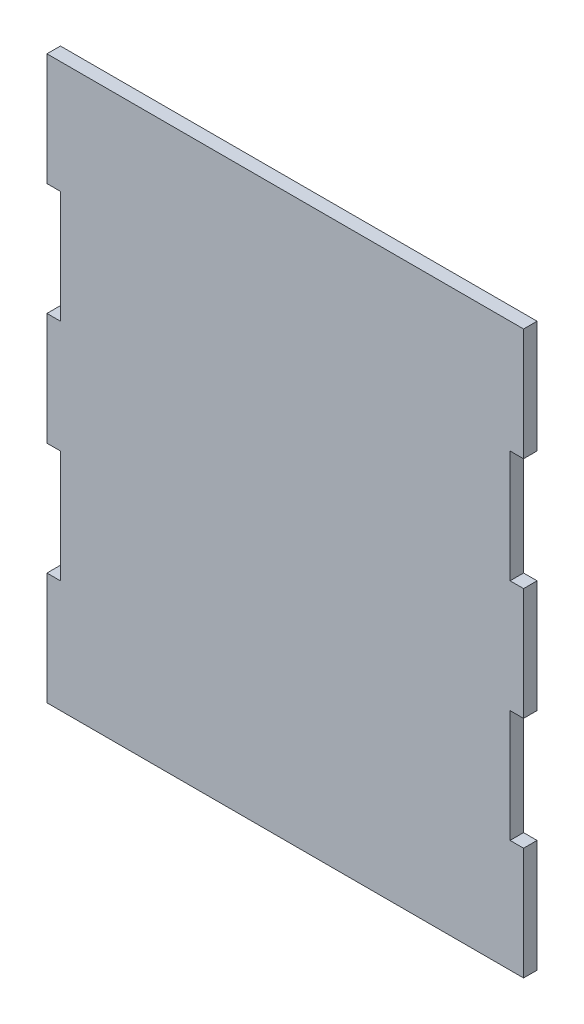
ISO-10303-21;
HEADER;
FILE_DESCRIPTION(('STEP AP214'),'2;1');
FILE_NAME('part.step','',(''),(''),'','','');
FILE_SCHEMA(('AUTOMOTIVE_DESIGN { 1 0 10303 214 1 1 1 1 }'));
ENDSEC;
DATA;
#1=APPLICATION_CONTEXT('core data for automotive mechanical design processes');
#2=APPLICATION_PROTOCOL_DEFINITION('international standard','automotive_design',2000,#1);
#3=PRODUCT_CONTEXT('',#1,'mechanical');
#4=PRODUCT('Part','Part','',(#3));
#5=PRODUCT_RELATED_PRODUCT_CATEGORY('part','',(#4));
#6=PRODUCT_DEFINITION_FORMATION('','',#4);
#7=PRODUCT_DEFINITION_CONTEXT('part definition',#1,'design');
#8=PRODUCT_DEFINITION('design','',#6,#7);
#9=PRODUCT_DEFINITION_SHAPE('','',#8);
#10=(LENGTH_UNIT() NAMED_UNIT(*) SI_UNIT(.MILLI.,.METRE.));
#11=(NAMED_UNIT(*) PLANE_ANGLE_UNIT() SI_UNIT($,.RADIAN.));
#12=(NAMED_UNIT(*) SI_UNIT($,.STERADIAN.) SOLID_ANGLE_UNIT());
#13=UNCERTAINTY_MEASURE_WITH_UNIT(LENGTH_MEASURE(1.E-05),#10,'distance_accuracy_value','');
#14=(GEOMETRIC_REPRESENTATION_CONTEXT(3) GLOBAL_UNCERTAINTY_ASSIGNED_CONTEXT((#13)) GLOBAL_UNIT_ASSIGNED_CONTEXT((#10,
#11,#12)) REPRESENTATION_CONTEXT('',''));
#15=CARTESIAN_POINT('',(0.,0.,0.));
#16=DIRECTION('',(0.,0.,1.));
#17=DIRECTION('',(1.,0.,0.));
#18=AXIS2_PLACEMENT_3D('',#15,#16,#17);
#19=CARTESIAN_POINT('',(53.,0.,3.));
#20=DIRECTION('',(-1.,0.,0.));
#21=DIRECTION('',(0.,0.,1.));
#22=AXIS2_PLACEMENT_3D('',#19,#20,#21);
#23=PLANE('',#22);
#24=DIRECTION('',(0.,1.,0.));
#25=VECTOR('',#24,1.);
#26=CARTESIAN_POINT('',(53.,0.,0.));
#27=LINE('',#26,#25);
#28=CARTESIAN_POINT('',(53.,-25.,0.));
#29=VERTEX_POINT('',#28);
#30=CARTESIAN_POINT('',(53.,0.,0.));
#31=VERTEX_POINT('',#30);
#32=EDGE_CURVE('E201',#29,#31,#27,.T.);
#33=ORIENTED_EDGE('',*,*,#32,.T.);
#34=DIRECTION('',(0.,0.,-1.));
#35=VECTOR('',#34,1.);
#36=CARTESIAN_POINT('',(53.,0.,3.));
#37=LINE('',#36,#35);
#38=CARTESIAN_POINT('',(53.,0.,3.));
#39=VERTEX_POINT('',#38);
#40=EDGE_CURVE('E11',#39,#31,#37,.T.);
#41=ORIENTED_EDGE('',*,*,#40,.F.);
#42=DIRECTION('',(0.,1.,0.));
#43=VECTOR('',#42,1.);
#44=CARTESIAN_POINT('',(53.,0.,3.));
#45=LINE('',#44,#43);
#46=CARTESIAN_POINT('',(53.,-25.,3.));
#47=VERTEX_POINT('',#46);
#48=EDGE_CURVE('E239',#47,#39,#45,.T.);
#49=ORIENTED_EDGE('',*,*,#48,.F.);
#50=DIRECTION('',(0.,0.,-1.));
#51=VECTOR('',#50,1.);
#52=CARTESIAN_POINT('',(53.,-25.,3.));
#53=LINE('',#52,#51);
#54=EDGE_CURVE('E197',#47,#29,#53,.T.);
#55=ORIENTED_EDGE('',*,*,#54,.T.);
#56=EDGE_LOOP('',(#33,#41,#49,#55));
#57=FACE_BOUND('',#56,.T.);
#58=ADVANCED_FACE('F33',(#57),#23,.F.);
#59=CARTESIAN_POINT('',(-53.,8.53206392293518E-13,3.));
#60=DIRECTION('',(0.,-1.,0.));
#61=DIRECTION('',(1.,0.,0.));
#62=AXIS2_PLACEMENT_3D('',#59,#60,#61);
#63=PLANE('',#62);
#64=DIRECTION('',(-1.,0.,0.));
#65=VECTOR('',#64,1.);
#66=CARTESIAN_POINT('',(-53.,8.53206392293518E-13,0.));
#67=LINE('',#66,#65);
#68=CARTESIAN_POINT('',(-53.,8.53206392293518E-13,0.));
#69=VERTEX_POINT('',#68);
#70=EDGE_CURVE('E204',#31,#69,#67,.T.);
#71=ORIENTED_EDGE('',*,*,#70,.T.);
#72=DIRECTION('',(0.,0.,-1.));
#73=VECTOR('',#72,1.);
#74=CARTESIAN_POINT('',(-53.,8.53206392293518E-13,3.));
#75=LINE('',#74,#73);
#76=CARTESIAN_POINT('',(-53.,8.53206392293518E-13,3.));
#77=VERTEX_POINT('',#76);
#78=EDGE_CURVE('E41',#77,#69,#75,.T.);
#79=ORIENTED_EDGE('',*,*,#78,.F.);
#80=DIRECTION('',(-1.,0.,0.));
#81=VECTOR('',#80,1.);
#82=CARTESIAN_POINT('',(-53.,8.53206392293518E-13,3.));
#83=LINE('',#82,#81);
#84=EDGE_CURVE('E128',#39,#77,#83,.T.);
#85=ORIENTED_EDGE('',*,*,#84,.F.);
#86=ORIENTED_EDGE('',*,*,#40,.T.);
#87=EDGE_LOOP('',(#71,#79,#85,#86));
#88=FACE_BOUND('',#87,.T.);
#89=ADVANCED_FACE('F357',(#88),#63,.F.);
#90=CARTESIAN_POINT('',(-53.,8.53206392293518E-13,3.));
#91=DIRECTION('',(1.,0.,0.));
#92=DIRECTION('',(0.,1.,0.));
#93=AXIS2_PLACEMENT_3D('',#90,#91,#92);
#94=PLANE('',#93);
#95=DIRECTION('',(0.,-1.,0.));
#96=VECTOR('',#95,1.);
#97=CARTESIAN_POINT('',(-53.,8.53206392293518E-13,0.));
#98=LINE('',#97,#96);
#99=CARTESIAN_POINT('',(-53.0000000000004,-24.9999999999991,0.));
#100=VERTEX_POINT('',#99);
#101=EDGE_CURVE('E206',#69,#100,#98,.T.);
#102=ORIENTED_EDGE('',*,*,#101,.T.);
#103=DIRECTION('',(0.,0.,-1.));
#104=VECTOR('',#103,1.);
#105=CARTESIAN_POINT('',(-53.0000000000004,-24.9999999999991,3.));
#106=LINE('',#105,#104);
#107=CARTESIAN_POINT('',(-53.0000000000004,-24.9999999999991,3.));
#108=VERTEX_POINT('',#107);
#109=EDGE_CURVE('E282',#108,#100,#106,.T.);
#110=ORIENTED_EDGE('',*,*,#109,.F.);
#111=DIRECTION('',(0.,-1.,0.));
#112=VECTOR('',#111,1.);
#113=CARTESIAN_POINT('',(-53.,8.53206392293518E-13,3.));
#114=LINE('',#113,#112);
#115=EDGE_CURVE('E290',#77,#108,#114,.T.);
#116=ORIENTED_EDGE('',*,*,#115,.F.);
#117=ORIENTED_EDGE('',*,*,#78,.T.);
#118=EDGE_LOOP('',(#102,#110,#116,#117));
#119=FACE_BOUND('',#118,.T.);
#120=ADVANCED_FACE('F288',(#119),#94,.F.);
#121=CARTESIAN_POINT('',(-53.0000000000004,-24.9999999999991,3.));
#122=DIRECTION('',(0.,1.,0.));
#123=DIRECTION('',(-1.,0.,0.));
#124=AXIS2_PLACEMENT_3D('',#121,#122,#123);
#125=PLANE('',#124);
#126=DIRECTION('',(1.,0.,0.));
#127=VECTOR('',#126,1.);
#128=CARTESIAN_POINT('',(-53.0000000000004,-24.9999999999991,0.));
#129=LINE('',#128,#127);
#130=CARTESIAN_POINT('',(-50.0000000000004,-24.9999999999992,0.));
#131=VERTEX_POINT('',#130);
#132=EDGE_CURVE('E208',#100,#131,#129,.T.);
#133=ORIENTED_EDGE('',*,*,#132,.T.);
#134=DIRECTION('',(0.,0.,-1.));
#135=VECTOR('',#134,1.);
#136=CARTESIAN_POINT('',(-50.0000000000004,-24.9999999999992,3.));
#137=LINE('',#136,#135);
#138=CARTESIAN_POINT('',(-50.0000000000004,-24.9999999999992,3.));
#139=VERTEX_POINT('',#138);
#140=EDGE_CURVE('E279',#139,#131,#137,.T.);
#141=ORIENTED_EDGE('',*,*,#140,.F.);
#142=DIRECTION('',(1.,0.,0.));
#143=VECTOR('',#142,1.);
#144=CARTESIAN_POINT('',(-53.0000000000004,-24.9999999999991,3.));
#145=LINE('',#144,#143);
#146=EDGE_CURVE('E308',#108,#139,#145,.T.);
#147=ORIENTED_EDGE('',*,*,#146,.F.);
#148=ORIENTED_EDGE('',*,*,#109,.T.);
#149=EDGE_LOOP('',(#133,#141,#147,#148));
#150=FACE_BOUND('',#149,.T.);
#151=ADVANCED_FACE('F299',(#150),#125,.F.);
#152=CARTESIAN_POINT('',(-50.0000000000004,-24.9999999999992,3.));
#153=DIRECTION('',(1.,0.,0.));
#154=DIRECTION('',(0.,1.,0.));
#155=AXIS2_PLACEMENT_3D('',#152,#153,#154);
#156=PLANE('',#155);
#157=DIRECTION('',(0.,-1.,0.));
#158=VECTOR('',#157,1.);
#159=CARTESIAN_POINT('',(-50.0000000000004,-24.9999999999992,0.));
#160=LINE('',#159,#158);
#161=CARTESIAN_POINT('',(-50.0000000000008,-49.9999999999992,0.));
#162=VERTEX_POINT('',#161);
#163=EDGE_CURVE('E210',#131,#162,#160,.T.);
#164=ORIENTED_EDGE('',*,*,#163,.T.);
#165=DIRECTION('',(0.,0.,-1.));
#166=VECTOR('',#165,1.);
#167=CARTESIAN_POINT('',(-50.0000000000008,-49.9999999999992,3.));
#168=LINE('',#167,#166);
#169=CARTESIAN_POINT('',(-50.0000000000008,-49.9999999999992,3.));
#170=VERTEX_POINT('',#169);
#171=EDGE_CURVE('E276',#170,#162,#168,.T.);
#172=ORIENTED_EDGE('',*,*,#171,.F.);
#173=DIRECTION('',(0.,-1.,0.));
#174=VECTOR('',#173,1.);
#175=CARTESIAN_POINT('',(-50.0000000000004,-24.9999999999992,3.));
#176=LINE('',#175,#174);
#177=EDGE_CURVE('E305',#139,#170,#176,.T.);
#178=ORIENTED_EDGE('',*,*,#177,.F.);
#179=ORIENTED_EDGE('',*,*,#140,.T.);
#180=EDGE_LOOP('',(#164,#172,#178,#179));
#181=FACE_BOUND('',#180,.T.);
#182=ADVANCED_FACE('F303',(#181),#156,.F.);
#183=CARTESIAN_POINT('',(-53.0000000000008,-50.0000001560952,3.));
#184=DIRECTION('',(5.2031994453768E-08,-0.999999999999999,0.));
#185=DIRECTION('',(0.999999999999999,5.2031994453768E-08,0.));
#186=AXIS2_PLACEMENT_3D('',#183,#184,#185);
#187=PLANE('',#186);
#188=DIRECTION('',(-0.999999999999999,-5.2031994453768E-08,0.));
#189=VECTOR('',#188,1.);
#190=CARTESIAN_POINT('',(-53.0000000000008,-50.0000001560952,0.));
#191=LINE('',#190,#189);
#192=CARTESIAN_POINT('',(-53.0000000000008,-50.0000001560952,0.));
#193=VERTEX_POINT('',#192);
#194=EDGE_CURVE('E212',#162,#193,#191,.T.);
#195=ORIENTED_EDGE('',*,*,#194,.T.);
#196=DIRECTION('',(0.,0.,-1.));
#197=VECTOR('',#196,1.);
#198=CARTESIAN_POINT('',(-53.0000000000008,-50.0000001560952,3.));
#199=LINE('',#198,#197);
#200=CARTESIAN_POINT('',(-53.0000000000008,-50.0000001560952,3.));
#201=VERTEX_POINT('',#200);
#202=EDGE_CURVE('E273',#201,#193,#199,.T.);
#203=ORIENTED_EDGE('',*,*,#202,.F.);
#204=DIRECTION('',(-0.999999999999999,-5.2031994453768E-08,0.));
#205=VECTOR('',#204,1.);
#206=CARTESIAN_POINT('',(-53.0000000000008,-50.0000001560952,3.));
#207=LINE('',#206,#205);
#208=EDGE_CURVE('E307',#170,#201,#207,.T.);
#209=ORIENTED_EDGE('',*,*,#208,.F.);
#210=ORIENTED_EDGE('',*,*,#171,.T.);
#211=EDGE_LOOP('',(#195,#203,#209,#210));
#212=FACE_BOUND('',#211,.T.);
#213=ADVANCED_FACE('F370',(#212),#187,.F.);
#214=CARTESIAN_POINT('',(-53.0000000000008,-50.0000001560952,3.));
#215=DIRECTION('',(1.,0.,0.));
#216=DIRECTION('',(0.,1.,0.));
#217=AXIS2_PLACEMENT_3D('',#214,#215,#216);
#218=PLANE('',#217);
#219=DIRECTION('',(0.,-1.,0.));
#220=VECTOR('',#219,1.);
#221=CARTESIAN_POINT('',(-53.0000000000008,-50.0000001560952,0.));
#222=LINE('',#221,#220);
#223=CARTESIAN_POINT('',(-53.,-75.000000156096,0.));
#224=VERTEX_POINT('',#223);
#225=EDGE_CURVE('E214',#193,#224,#222,.T.);
#226=ORIENTED_EDGE('',*,*,#225,.T.);
#227=DIRECTION('',(0.,0.,-1.));
#228=VECTOR('',#227,1.);
#229=CARTESIAN_POINT('',(-53.,-75.000000156096,3.));
#230=LINE('',#229,#228);
#231=CARTESIAN_POINT('',(-53.,-75.000000156096,3.));
#232=VERTEX_POINT('',#231);
#233=EDGE_CURVE('E270',#232,#224,#230,.T.);
#234=ORIENTED_EDGE('',*,*,#233,.F.);
#235=DIRECTION('',(0.,-1.,0.));
#236=VECTOR('',#235,1.);
#237=CARTESIAN_POINT('',(-53.0000000000008,-50.0000001560952,3.));
#238=LINE('',#237,#236);
#239=EDGE_CURVE('E310',#201,#232,#238,.T.);
#240=ORIENTED_EDGE('',*,*,#239,.F.);
#241=ORIENTED_EDGE('',*,*,#202,.T.);
#242=EDGE_LOOP('',(#226,#234,#240,#241));
#243=FACE_BOUND('',#242,.T.);
#244=ADVANCED_FACE('F373',(#243),#218,.F.);
#245=CARTESIAN_POINT('',(-53.,-75.000000156096,3.));
#246=DIRECTION('',(0.,1.,0.));
#247=DIRECTION('',(-1.,0.,0.));
#248=AXIS2_PLACEMENT_3D('',#245,#246,#247);
#249=PLANE('',#248);
#250=DIRECTION('',(1.,0.,0.));
#251=VECTOR('',#250,1.);
#252=CARTESIAN_POINT('',(-53.,-75.000000156096,0.));
#253=LINE('',#252,#251);
#254=CARTESIAN_POINT('',(-50.0000000000005,-75.000000156096,0.));
#255=VERTEX_POINT('',#254);
#256=EDGE_CURVE('E216',#224,#255,#253,.T.);
#257=ORIENTED_EDGE('',*,*,#256,.T.);
#258=DIRECTION('',(0.,0.,-1.));
#259=VECTOR('',#258,1.);
#260=CARTESIAN_POINT('',(-50.0000000000005,-75.000000156096,3.));
#261=LINE('',#260,#259);
#262=CARTESIAN_POINT('',(-50.0000000000005,-75.000000156096,3.));
#263=VERTEX_POINT('',#262);
#264=EDGE_CURVE('E267',#263,#255,#261,.T.);
#265=ORIENTED_EDGE('',*,*,#264,.F.);
#266=DIRECTION('',(1.,0.,0.));
#267=VECTOR('',#266,1.);
#268=CARTESIAN_POINT('',(-53.,-75.000000156096,3.));
#269=LINE('',#268,#267);
#270=EDGE_CURVE('E316',#232,#263,#269,.T.);
#271=ORIENTED_EDGE('',*,*,#270,.F.);
#272=ORIENTED_EDGE('',*,*,#233,.T.);
#273=EDGE_LOOP('',(#257,#265,#271,#272));
#274=FACE_BOUND('',#273,.T.);
#275=ADVANCED_FACE('F377',(#274),#249,.F.);
#276=CARTESIAN_POINT('',(-50.0000000000005,-75.000000156096,3.));
#277=DIRECTION('',(1.,0.,0.));
#278=DIRECTION('',(0.,0.,-1.));
#279=AXIS2_PLACEMENT_3D('',#276,#277,#278);
#280=PLANE('',#279);
#281=DIRECTION('',(0.,-1.,0.));
#282=VECTOR('',#281,1.);
#283=CARTESIAN_POINT('',(-50.0000000000005,-75.000000156096,0.));
#284=LINE('',#283,#282);
#285=CARTESIAN_POINT('',(-50.0000000000005,-100.000000156096,0.));
#286=VERTEX_POINT('',#285);
#287=EDGE_CURVE('E218',#255,#286,#284,.T.);
#288=ORIENTED_EDGE('',*,*,#287,.T.);
#289=DIRECTION('',(0.,0.,-1.));
#290=VECTOR('',#289,1.);
#291=CARTESIAN_POINT('',(-50.0000000000005,-100.000000156096,3.));
#292=LINE('',#291,#290);
#293=CARTESIAN_POINT('',(-50.0000000000005,-100.000000156096,3.));
#294=VERTEX_POINT('',#293);
#295=EDGE_CURVE('E264',#294,#286,#292,.T.);
#296=ORIENTED_EDGE('',*,*,#295,.F.);
#297=DIRECTION('',(0.,-1.,0.));
#298=VECTOR('',#297,1.);
#299=CARTESIAN_POINT('',(-50.0000000000005,-75.000000156096,3.));
#300=LINE('',#299,#298);
#301=EDGE_CURVE('E318',#263,#294,#300,.T.);
#302=ORIENTED_EDGE('',*,*,#301,.F.);
#303=ORIENTED_EDGE('',*,*,#264,.T.);
#304=EDGE_LOOP('',(#288,#296,#302,#303));
#305=FACE_BOUND('',#304,.T.);
#306=ADVANCED_FACE('F381',(#305),#280,.F.);
#307=CARTESIAN_POINT('',(-53.0000000000016,-100.000000312191,3.));
#308=DIRECTION('',(5.20317261498514E-08,-0.999999999999999,0.));
#309=DIRECTION('',(0.999999999999999,5.20317261498514E-08,0.));
#310=AXIS2_PLACEMENT_3D('',#307,#308,#309);
#311=PLANE('',#310);
#312=DIRECTION('',(-0.999999999999999,-5.20317261498514E-08,0.));
#313=VECTOR('',#312,1.);
#314=CARTESIAN_POINT('',(-53.0000000000016,-100.000000312191,0.));
#315=LINE('',#314,#313);
#316=CARTESIAN_POINT('',(-53.0000000000016,-100.000000312191,0.));
#317=VERTEX_POINT('',#316);
#318=EDGE_CURVE('E220',#286,#317,#315,.T.);
#319=ORIENTED_EDGE('',*,*,#318,.T.);
#320=DIRECTION('',(0.,0.,-1.));
#321=VECTOR('',#320,1.);
#322=CARTESIAN_POINT('',(-53.0000000000016,-100.000000312191,3.));
#323=LINE('',#322,#321);
#324=CARTESIAN_POINT('',(-53.0000000000016,-100.000000312191,3.));
#325=VERTEX_POINT('',#324);
#326=EDGE_CURVE('E261',#325,#317,#323,.T.);
#327=ORIENTED_EDGE('',*,*,#326,.F.);
#328=DIRECTION('',(-0.999999999999999,-5.20317261498514E-08,0.));
#329=VECTOR('',#328,1.);
#330=CARTESIAN_POINT('',(-53.0000000000016,-100.000000312191,3.));
#331=LINE('',#330,#329);
#332=EDGE_CURVE('E320',#294,#325,#331,.T.);
#333=ORIENTED_EDGE('',*,*,#332,.F.);
#334=ORIENTED_EDGE('',*,*,#295,.T.);
#335=EDGE_LOOP('',(#319,#327,#333,#334));
#336=FACE_BOUND('',#335,.T.);
#337=ADVANCED_FACE('F385',(#336),#311,.F.);
#338=CARTESIAN_POINT('',(-53.0000000000016,-100.000000312191,3.));
#339=DIRECTION('',(1.,0.,0.));
#340=DIRECTION('',(0.,1.,0.));
#341=AXIS2_PLACEMENT_3D('',#338,#339,#340);
#342=PLANE('',#341);
#343=DIRECTION('',(0.,-1.,0.));
#344=VECTOR('',#343,1.);
#345=CARTESIAN_POINT('',(-53.0000000000016,-100.000000312191,0.));
#346=LINE('',#345,#344);
#347=CARTESIAN_POINT('',(-53.,-125.000000312192,0.));
#348=VERTEX_POINT('',#347);
#349=EDGE_CURVE('E222',#317,#348,#346,.T.);
#350=ORIENTED_EDGE('',*,*,#349,.T.);
#351=DIRECTION('',(0.,0.,-1.));
#352=VECTOR('',#351,1.);
#353=CARTESIAN_POINT('',(-53.,-125.000000312192,3.));
#354=LINE('',#353,#352);
#355=CARTESIAN_POINT('',(-53.,-125.000000312192,3.));
#356=VERTEX_POINT('',#355);
#357=EDGE_CURVE('E258',#356,#348,#354,.T.);
#358=ORIENTED_EDGE('',*,*,#357,.F.);
#359=DIRECTION('',(0.,-1.,0.));
#360=VECTOR('',#359,1.);
#361=CARTESIAN_POINT('',(-53.0000000000016,-100.000000312191,3.));
#362=LINE('',#361,#360);
#363=EDGE_CURVE('E322',#325,#356,#362,.T.);
#364=ORIENTED_EDGE('',*,*,#363,.F.);
#365=ORIENTED_EDGE('',*,*,#326,.T.);
#366=EDGE_LOOP('',(#350,#358,#364,#365));
#367=FACE_BOUND('',#366,.T.);
#368=ADVANCED_FACE('F389',(#367),#342,.F.);
#369=CARTESIAN_POINT('',(53.,-125.000000312192,3.));
#370=DIRECTION('',(0.,1.,0.));
#371=DIRECTION('',(0.,0.,1.));
#372=AXIS2_PLACEMENT_3D('',#369,#370,#371);
#373=PLANE('',#372);
#374=DIRECTION('',(1.,0.,0.));
#375=VECTOR('',#374,1.);
#376=CARTESIAN_POINT('',(53.,-125.000000312192,0.));
#377=LINE('',#376,#375);
#378=CARTESIAN_POINT('',(53.,-125.000000312192,0.));
#379=VERTEX_POINT('',#378);
#380=EDGE_CURVE('E224',#348,#379,#377,.T.);
#381=ORIENTED_EDGE('',*,*,#380,.T.);
#382=DIRECTION('',(0.,0.,-1.));
#383=VECTOR('',#382,1.);
#384=CARTESIAN_POINT('',(53.,-125.000000312192,3.));
#385=LINE('',#384,#383);
#386=CARTESIAN_POINT('',(53.,-125.000000312192,3.));
#387=VERTEX_POINT('',#386);
#388=EDGE_CURVE('E255',#387,#379,#385,.T.);
#389=ORIENTED_EDGE('',*,*,#388,.F.);
#390=DIRECTION('',(1.,0.,0.));
#391=VECTOR('',#390,1.);
#392=CARTESIAN_POINT('',(53.,-125.000000312192,3.));
#393=LINE('',#392,#391);
#394=EDGE_CURVE('E324',#356,#387,#393,.T.);
#395=ORIENTED_EDGE('',*,*,#394,.F.);
#396=ORIENTED_EDGE('',*,*,#357,.T.);
#397=EDGE_LOOP('',(#381,#389,#395,#396));
#398=FACE_BOUND('',#397,.T.);
#399=ADVANCED_FACE('F393',(#398),#373,.F.);
#400=CARTESIAN_POINT('',(53.,-100.000000312192,3.));
#401=DIRECTION('',(-1.,0.,0.));
#402=DIRECTION('',(0.,0.,1.));
#403=AXIS2_PLACEMENT_3D('',#400,#401,#402);
#404=PLANE('',#403);
#405=DIRECTION('',(0.,1.,0.));
#406=VECTOR('',#405,1.);
#407=CARTESIAN_POINT('',(53.,-100.000000312192,0.));
#408=LINE('',#407,#406);
#409=CARTESIAN_POINT('',(53.,-100.000000312192,0.));
#410=VERTEX_POINT('',#409);
#411=EDGE_CURVE('E226',#379,#410,#408,.T.);
#412=ORIENTED_EDGE('',*,*,#411,.T.);
#413=DIRECTION('',(0.,0.,-1.));
#414=VECTOR('',#413,1.);
#415=CARTESIAN_POINT('',(53.,-100.000000312192,3.));
#416=LINE('',#415,#414);
#417=CARTESIAN_POINT('',(53.,-100.000000312192,3.));
#418=VERTEX_POINT('',#417);
#419=EDGE_CURVE('E252',#418,#410,#416,.T.);
#420=ORIENTED_EDGE('',*,*,#419,.F.);
#421=DIRECTION('',(0.,1.,0.));
#422=VECTOR('',#421,1.);
#423=CARTESIAN_POINT('',(53.,-100.000000312192,3.));
#424=LINE('',#423,#422);
#425=EDGE_CURVE('E326',#387,#418,#424,.T.);
#426=ORIENTED_EDGE('',*,*,#425,.F.);
#427=ORIENTED_EDGE('',*,*,#388,.T.);
#428=EDGE_LOOP('',(#412,#420,#426,#427));
#429=FACE_BOUND('',#428,.T.);
#430=ADVANCED_FACE('F397',(#429),#404,.F.);
#431=CARTESIAN_POINT('',(53.,-100.000000312192,3.));
#432=DIRECTION('',(-5.20320083315647E-08,-0.999999999999999,0.));
#433=DIRECTION('',(0.999999999999999,-5.20320083315647E-08,0.));
#434=AXIS2_PLACEMENT_3D('',#431,#432,#433);
#435=PLANE('',#434);
#436=DIRECTION('',(-0.999999999999999,5.20320083315647E-08,0.));
#437=VECTOR('',#436,1.);
#438=CARTESIAN_POINT('',(53.,-100.000000312192,0.));
#439=LINE('',#438,#437);
#440=CARTESIAN_POINT('',(50.0000000000005,-100.000000156096,0.));
#441=VERTEX_POINT('',#440);
#442=EDGE_CURVE('E228',#410,#441,#439,.T.);
#443=ORIENTED_EDGE('',*,*,#442,.T.);
#444=DIRECTION('',(0.,0.,-1.));
#445=VECTOR('',#444,1.);
#446=CARTESIAN_POINT('',(50.0000000000005,-100.000000156096,3.));
#447=LINE('',#446,#445);
#448=CARTESIAN_POINT('',(50.0000000000005,-100.000000156096,3.));
#449=VERTEX_POINT('',#448);
#450=EDGE_CURVE('E249',#449,#441,#447,.T.);
#451=ORIENTED_EDGE('',*,*,#450,.F.);
#452=DIRECTION('',(-0.999999999999999,5.20320083315647E-08,0.));
#453=VECTOR('',#452,1.);
#454=CARTESIAN_POINT('',(53.,-100.000000312192,3.));
#455=LINE('',#454,#453);
#456=EDGE_CURVE('E328',#418,#449,#455,.T.);
#457=ORIENTED_EDGE('',*,*,#456,.F.);
#458=ORIENTED_EDGE('',*,*,#419,.T.);
#459=EDGE_LOOP('',(#443,#451,#457,#458));
#460=FACE_BOUND('',#459,.T.);
#461=ADVANCED_FACE('F401',(#460),#435,.F.);
#462=CARTESIAN_POINT('',(50.0000000000005,-75.000000156096,3.));
#463=DIRECTION('',(-1.,0.,0.));
#464=DIRECTION('',(0.,0.,1.));
#465=AXIS2_PLACEMENT_3D('',#462,#463,#464);
#466=PLANE('',#465);
#467=DIRECTION('',(0.,1.,0.));
#468=VECTOR('',#467,1.);
#469=CARTESIAN_POINT('',(50.0000000000005,-75.000000156096,0.));
#470=LINE('',#469,#468);
#471=CARTESIAN_POINT('',(50.0000000000005,-75.000000156096,0.));
#472=VERTEX_POINT('',#471);
#473=EDGE_CURVE('E230',#441,#472,#470,.T.);
#474=ORIENTED_EDGE('',*,*,#473,.T.);
#475=DIRECTION('',(0.,0.,-1.));
#476=VECTOR('',#475,1.);
#477=CARTESIAN_POINT('',(50.0000000000005,-75.000000156096,3.));
#478=LINE('',#477,#476);
#479=CARTESIAN_POINT('',(50.0000000000005,-75.000000156096,3.));
#480=VERTEX_POINT('',#479);
#481=EDGE_CURVE('E246',#480,#472,#478,.T.);
#482=ORIENTED_EDGE('',*,*,#481,.F.);
#483=DIRECTION('',(0.,1.,0.));
#484=VECTOR('',#483,1.);
#485=CARTESIAN_POINT('',(50.0000000000005,-75.000000156096,3.));
#486=LINE('',#485,#484);
#487=EDGE_CURVE('E330',#449,#480,#486,.T.);
#488=ORIENTED_EDGE('',*,*,#487,.F.);
#489=ORIENTED_EDGE('',*,*,#450,.T.);
#490=EDGE_LOOP('',(#474,#482,#488,#489));
#491=FACE_BOUND('',#490,.T.);
#492=ADVANCED_FACE('F405',(#491),#466,.F.);
#493=CARTESIAN_POINT('',(53.,-75.000000156096,3.));
#494=DIRECTION('',(0.,1.,0.));
#495=DIRECTION('',(-1.,0.,0.));
#496=AXIS2_PLACEMENT_3D('',#493,#494,#495);
#497=PLANE('',#496);
#498=DIRECTION('',(1.,0.,0.));
#499=VECTOR('',#498,1.);
#500=CARTESIAN_POINT('',(53.,-75.000000156096,0.));
#501=LINE('',#500,#499);
#502=CARTESIAN_POINT('',(53.,-75.000000156096,0.));
#503=VERTEX_POINT('',#502);
#504=EDGE_CURVE('E232',#472,#503,#501,.T.);
#505=ORIENTED_EDGE('',*,*,#504,.T.);
#506=DIRECTION('',(0.,0.,-1.));
#507=VECTOR('',#506,1.);
#508=CARTESIAN_POINT('',(53.,-75.000000156096,3.));
#509=LINE('',#508,#507);
#510=CARTESIAN_POINT('',(53.,-75.000000156096,3.));
#511=VERTEX_POINT('',#510);
#512=EDGE_CURVE('E243',#511,#503,#509,.T.);
#513=ORIENTED_EDGE('',*,*,#512,.F.);
#514=DIRECTION('',(1.,0.,0.));
#515=VECTOR('',#514,1.);
#516=CARTESIAN_POINT('',(53.,-75.000000156096,3.));
#517=LINE('',#516,#515);
#518=EDGE_CURVE('E332',#480,#511,#517,.T.);
#519=ORIENTED_EDGE('',*,*,#518,.F.);
#520=ORIENTED_EDGE('',*,*,#481,.T.);
#521=EDGE_LOOP('',(#505,#513,#519,#520));
#522=FACE_BOUND('',#521,.T.);
#523=ADVANCED_FACE('F338',(#522),#497,.F.);
#524=CARTESIAN_POINT('',(53.,-50.000000156096,3.));
#525=DIRECTION('',(-1.,0.,0.));
#526=DIRECTION('',(0.,-1.,0.));
#527=AXIS2_PLACEMENT_3D('',#524,#525,#526);
#528=PLANE('',#527);
#529=DIRECTION('',(0.,1.,0.));
#530=VECTOR('',#529,1.);
#531=CARTESIAN_POINT('',(53.,-50.000000156096,0.));
#532=LINE('',#531,#530);
#533=CARTESIAN_POINT('',(53.,-50.000000156096,0.));
#534=VERTEX_POINT('',#533);
#535=EDGE_CURVE('E234',#503,#534,#532,.T.);
#536=ORIENTED_EDGE('',*,*,#535,.T.);
#537=DIRECTION('',(0.,0.,-1.));
#538=VECTOR('',#537,1.);
#539=CARTESIAN_POINT('',(53.,-50.000000156096,3.));
#540=LINE('',#539,#538);
#541=CARTESIAN_POINT('',(53.,-50.000000156096,3.));
#542=VERTEX_POINT('',#541);
#543=EDGE_CURVE('E192',#542,#534,#540,.T.);
#544=ORIENTED_EDGE('',*,*,#543,.F.);
#545=DIRECTION('',(0.,1.,0.));
#546=VECTOR('',#545,1.);
#547=CARTESIAN_POINT('',(53.,-50.000000156096,3.));
#548=LINE('',#547,#546);
#549=EDGE_CURVE('E183',#511,#542,#548,.T.);
#550=ORIENTED_EDGE('',*,*,#549,.F.);
#551=ORIENTED_EDGE('',*,*,#512,.T.);
#552=EDGE_LOOP('',(#536,#544,#550,#551));
#553=FACE_BOUND('',#552,.T.);
#554=ADVANCED_FACE('F342',(#553),#528,.F.);
#555=CARTESIAN_POINT('',(53.,-50.000000156096,3.));
#556=DIRECTION('',(-5.20320083315558E-08,-0.999999999999999,0.));
#557=DIRECTION('',(0.999999999999999,-5.20320083315558E-08,0.));
#558=AXIS2_PLACEMENT_3D('',#555,#556,#557);
#559=PLANE('',#558);
#560=DIRECTION('',(-0.999999999999999,5.20320083315558E-08,0.));
#561=VECTOR('',#560,1.);
#562=CARTESIAN_POINT('',(53.,-50.000000156096,0.));
#563=LINE('',#562,#561);
#564=CARTESIAN_POINT('',(50.,-50.,0.));
#565=VERTEX_POINT('',#564);
#566=EDGE_CURVE('E191',#534,#565,#563,.T.);
#567=ORIENTED_EDGE('',*,*,#566,.T.);
#568=DIRECTION('',(0.,0.,-1.));
#569=VECTOR('',#568,1.);
#570=CARTESIAN_POINT('',(50.,-50.,3.));
#571=LINE('',#570,#569);
#572=CARTESIAN_POINT('',(50.,-50.,3.));
#573=VERTEX_POINT('',#572);
#574=EDGE_CURVE('E188',#573,#565,#571,.T.);
#575=ORIENTED_EDGE('',*,*,#574,.F.);
#576=DIRECTION('',(-0.999999999999999,5.20320083315558E-08,0.));
#577=VECTOR('',#576,1.);
#578=CARTESIAN_POINT('',(53.,-50.000000156096,3.));
#579=LINE('',#578,#577);
#580=EDGE_CURVE('E177',#542,#573,#579,.T.);
#581=ORIENTED_EDGE('',*,*,#580,.F.);
#582=ORIENTED_EDGE('',*,*,#543,.T.);
#583=EDGE_LOOP('',(#567,#575,#581,#582));
#584=FACE_BOUND('',#583,.T.);
#585=ADVANCED_FACE('F189',(#584),#559,.F.);
#586=CARTESIAN_POINT('',(50.,-25.,3.));
#587=DIRECTION('',(-1.,0.,0.));
#588=DIRECTION('',(0.,0.,1.));
#589=AXIS2_PLACEMENT_3D('',#586,#587,#588);
#590=PLANE('',#589);
#591=DIRECTION('',(0.,1.,0.));
#592=VECTOR('',#591,1.);
#593=CARTESIAN_POINT('',(50.,-25.,0.));
#594=LINE('',#593,#592);
#595=CARTESIAN_POINT('',(50.,-25.,0.));
#596=VERTEX_POINT('',#595);
#597=EDGE_CURVE('E114',#565,#596,#594,.T.);
#598=ORIENTED_EDGE('',*,*,#597,.T.);
#599=DIRECTION('',(0.,0.,-1.));
#600=VECTOR('',#599,1.);
#601=CARTESIAN_POINT('',(50.,-25.,3.));
#602=LINE('',#601,#600);
#603=CARTESIAN_POINT('',(50.,-25.,3.));
#604=VERTEX_POINT('',#603);
#605=EDGE_CURVE('E193',#604,#596,#602,.T.);
#606=ORIENTED_EDGE('',*,*,#605,.F.);
#607=DIRECTION('',(0.,1.,0.));
#608=VECTOR('',#607,1.);
#609=CARTESIAN_POINT('',(50.,-25.,3.));
#610=LINE('',#609,#608);
#611=EDGE_CURVE('E181',#573,#604,#610,.T.);
#612=ORIENTED_EDGE('',*,*,#611,.F.);
#613=ORIENTED_EDGE('',*,*,#574,.T.);
#614=EDGE_LOOP('',(#598,#606,#612,#613));
#615=FACE_BOUND('',#614,.T.);
#616=ADVANCED_FACE('F195',(#615),#590,.F.);
#617=CARTESIAN_POINT('',(53.,-25.,3.));
#618=DIRECTION('',(0.,1.,0.));
#619=DIRECTION('',(0.,0.,1.));
#620=AXIS2_PLACEMENT_3D('',#617,#618,#619);
#621=PLANE('',#620);
#622=DIRECTION('',(1.,0.,0.));
#623=VECTOR('',#622,1.);
#624=CARTESIAN_POINT('',(53.,-25.,0.));
#625=LINE('',#624,#623);
#626=EDGE_CURVE('E120',#596,#29,#625,.T.);
#627=ORIENTED_EDGE('',*,*,#626,.T.);
#628=ORIENTED_EDGE('',*,*,#54,.F.);
#629=DIRECTION('',(1.,0.,0.));
#630=VECTOR('',#629,1.);
#631=CARTESIAN_POINT('',(53.,-25.,3.));
#632=LINE('',#631,#630);
#633=EDGE_CURVE('E49',#604,#47,#632,.T.);
#634=ORIENTED_EDGE('',*,*,#633,.F.);
#635=ORIENTED_EDGE('',*,*,#605,.T.);
#636=EDGE_LOOP('',(#627,#628,#634,#635));
#637=FACE_BOUND('',#636,.T.);
#638=ADVANCED_FACE('F346',(#637),#621,.F.);
#639=CARTESIAN_POINT('',(0.,0.,3.));
#640=DIRECTION('',(0.,0.,-1.));
#641=DIRECTION('',(-1.,0.,0.));
#642=AXIS2_PLACEMENT_3D('',#639,#640,#641);
#643=PLANE('',#642);
#644=ORIENTED_EDGE('',*,*,#48,.T.);
#645=ORIENTED_EDGE('',*,*,#84,.T.);
#646=ORIENTED_EDGE('',*,*,#115,.T.);
#647=ORIENTED_EDGE('',*,*,#146,.T.);
#648=ORIENTED_EDGE('',*,*,#177,.T.);
#649=ORIENTED_EDGE('',*,*,#208,.T.);
#650=ORIENTED_EDGE('',*,*,#239,.T.);
#651=ORIENTED_EDGE('',*,*,#270,.T.);
#652=ORIENTED_EDGE('',*,*,#301,.T.);
#653=ORIENTED_EDGE('',*,*,#332,.T.);
#654=ORIENTED_EDGE('',*,*,#363,.T.);
#655=ORIENTED_EDGE('',*,*,#394,.T.);
#656=ORIENTED_EDGE('',*,*,#425,.T.);
#657=ORIENTED_EDGE('',*,*,#456,.T.);
#658=ORIENTED_EDGE('',*,*,#487,.T.);
#659=ORIENTED_EDGE('',*,*,#518,.T.);
#660=ORIENTED_EDGE('',*,*,#549,.T.);
#661=ORIENTED_EDGE('',*,*,#580,.T.);
#662=ORIENTED_EDGE('',*,*,#611,.T.);
#663=ORIENTED_EDGE('',*,*,#633,.T.);
#664=EDGE_LOOP('',(#644,#645,#646,#647,#648,#649,#650,#651,#652,#653,#654,#655,#656,#657,#658,
#659,#660,#661,#662,#663));
#665=FACE_BOUND('',#664,.T.);
#666=ADVANCED_FACE('F179',(#665),#643,.F.);
#667=CARTESIAN_POINT('',(0.,0.,0.));
#668=DIRECTION('',(0.,0.,-1.));
#669=DIRECTION('',(-1.,0.,0.));
#670=AXIS2_PLACEMENT_3D('',#667,#668,#669);
#671=PLANE('',#670);
#672=ORIENTED_EDGE('',*,*,#32,.F.);
#673=ORIENTED_EDGE('',*,*,#626,.F.);
#674=ORIENTED_EDGE('',*,*,#597,.F.);
#675=ORIENTED_EDGE('',*,*,#566,.F.);
#676=ORIENTED_EDGE('',*,*,#535,.F.);
#677=ORIENTED_EDGE('',*,*,#504,.F.);
#678=ORIENTED_EDGE('',*,*,#473,.F.);
#679=ORIENTED_EDGE('',*,*,#442,.F.);
#680=ORIENTED_EDGE('',*,*,#411,.F.);
#681=ORIENTED_EDGE('',*,*,#380,.F.);
#682=ORIENTED_EDGE('',*,*,#349,.F.);
#683=ORIENTED_EDGE('',*,*,#318,.F.);
#684=ORIENTED_EDGE('',*,*,#287,.F.);
#685=ORIENTED_EDGE('',*,*,#256,.F.);
#686=ORIENTED_EDGE('',*,*,#225,.F.);
#687=ORIENTED_EDGE('',*,*,#194,.F.);
#688=ORIENTED_EDGE('',*,*,#163,.F.);
#689=ORIENTED_EDGE('',*,*,#132,.F.);
#690=ORIENTED_EDGE('',*,*,#101,.F.);
#691=ORIENTED_EDGE('',*,*,#70,.F.);
#692=EDGE_LOOP('',(#672,#673,#674,#675,#676,#677,#678,#679,#680,#681,#682,#683,#684,#685,#686,
#687,#688,#689,#690,#691));
#693=FACE_BOUND('',#692,.T.);
#694=ADVANCED_FACE('F294',(#693),#671,.T.);
#695=CLOSED_SHELL('',(#58,#89,#120,#151,#182,#213,#244,#275,#306,#337,#368,#399,#430,#461,#492,
#523,#554,#585,#616,#638,#666,#694));
#696=MANIFOLD_SOLID_BREP('B2',#695);
#697=ADVANCED_BREP_SHAPE_REPRESENTATION('',(#18,#696),#14);
#698=SHAPE_DEFINITION_REPRESENTATION(#9,#697);
ENDSEC;
END-ISO-10303-21;
